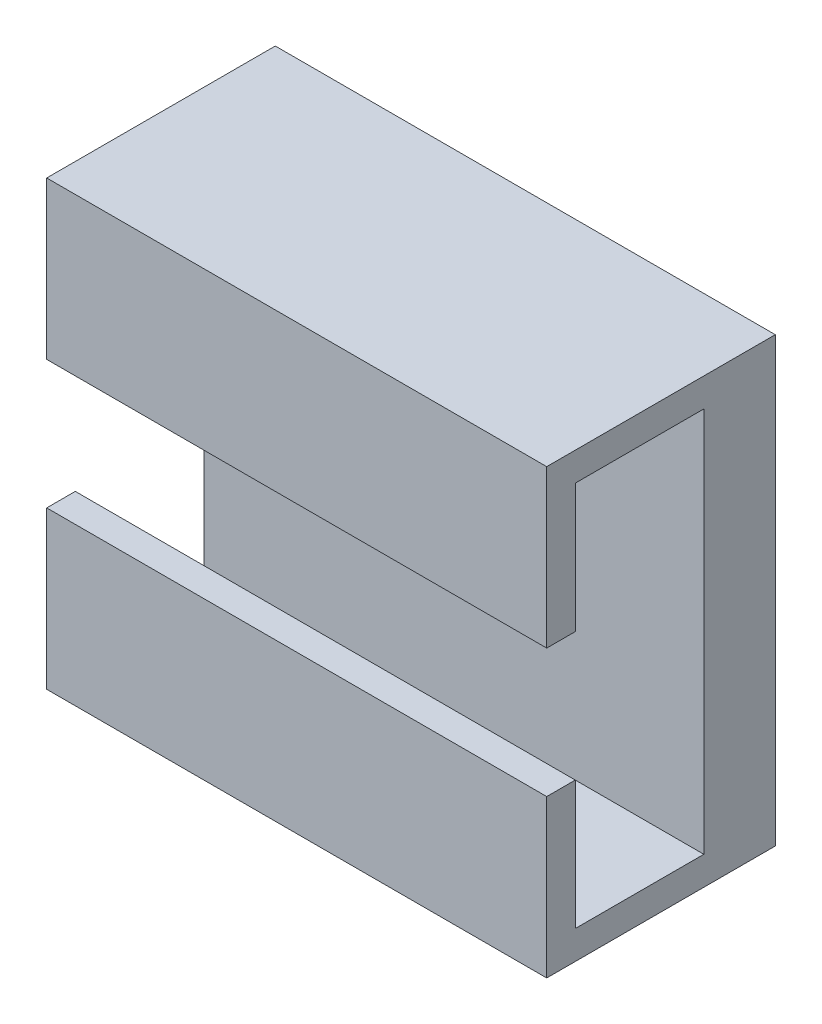
ISO-10303-21;
HEADER;
FILE_DESCRIPTION(('STEP AP214'),'2;1');
FILE_NAME('part.step','',(''),(''),'','','');
FILE_SCHEMA(('AUTOMOTIVE_DESIGN { 1 0 10303 214 1 1 1 1 }'));
ENDSEC;
DATA;
#1=APPLICATION_CONTEXT('core data for automotive mechanical design processes');
#2=APPLICATION_PROTOCOL_DEFINITION('international standard','automotive_design',2000,#1);
#3=PRODUCT_CONTEXT('',#1,'mechanical');
#4=PRODUCT('Part','Part','',(#3));
#5=PRODUCT_RELATED_PRODUCT_CATEGORY('part','',(#4));
#6=PRODUCT_DEFINITION_FORMATION('','',#4);
#7=PRODUCT_DEFINITION_CONTEXT('part definition',#1,'design');
#8=PRODUCT_DEFINITION('design','',#6,#7);
#9=PRODUCT_DEFINITION_SHAPE('','',#8);
#10=(LENGTH_UNIT() NAMED_UNIT(*) SI_UNIT(.MILLI.,.METRE.));
#11=(NAMED_UNIT(*) PLANE_ANGLE_UNIT() SI_UNIT($,.RADIAN.));
#12=(NAMED_UNIT(*) SI_UNIT($,.STERADIAN.) SOLID_ANGLE_UNIT());
#13=UNCERTAINTY_MEASURE_WITH_UNIT(LENGTH_MEASURE(1.E-05),#10,'distance_accuracy_value','');
#14=(GEOMETRIC_REPRESENTATION_CONTEXT(3) GLOBAL_UNCERTAINTY_ASSIGNED_CONTEXT((#13)) GLOBAL_UNIT_ASSIGNED_CONTEXT((#10,
#11,#12)) REPRESENTATION_CONTEXT('',''));
#15=CARTESIAN_POINT('',(0.,0.,0.));
#16=DIRECTION('',(0.,0.,1.));
#17=DIRECTION('',(1.,0.,0.));
#18=AXIS2_PLACEMENT_3D('',#15,#16,#17);
#19=CARTESIAN_POINT('',(0.,0.,0.));
#20=DIRECTION('',(0.,0.,1.));
#21=DIRECTION('',(1.,0.,0.));
#22=AXIS2_PLACEMENT_3D('',#19,#20,#21);
#23=CYLINDRICAL_SURFACE('',#22,1.75);
#24=CARTESIAN_POINT('',(0.,0.,0.));
#25=DIRECTION('',(0.,0.,1.));
#26=DIRECTION('',(1.,0.,0.));
#27=AXIS2_PLACEMENT_3D('',#24,#25,#26);
#28=CIRCLE('',#27,1.75);
#29=CARTESIAN_POINT('',(1.75,0.,0.));
#30=VERTEX_POINT('',#29);
#31=EDGE_CURVE('E176',#30,#30,#28,.T.);
#32=CARTESIAN_POINT('',(0.,0.,2.00000000000001));
#33=DIRECTION('',(0.,0.,1.));
#34=DIRECTION('',(1.,0.,0.));
#35=AXIS2_PLACEMENT_3D('',#32,#33,#34);
#36=CIRCLE('',#35,1.75);
#37=CARTESIAN_POINT('',(1.75,0.,2.00000000000001));
#38=VERTEX_POINT('',#37);
#39=EDGE_CURVE('E43',#38,#38,#36,.F.);
#40=CARTESIAN_POINT('',(1.75,0.,0.));
#41=CARTESIAN_POINT('',(1.75,0.,0.0208333333333335));
#42=CARTESIAN_POINT('',(1.75,0.,0.0416666666666669));
#43=CARTESIAN_POINT('',(1.75,0.,0.0833333333333337));
#44=CARTESIAN_POINT('',(1.75,0.,0.104166666666667));
#45=CARTESIAN_POINT('',(1.75,0.,0.145833333333334));
#46=CARTESIAN_POINT('',(1.75,0.,0.166666666666667));
#47=CARTESIAN_POINT('',(1.75,0.,0.208333333333334));
#48=CARTESIAN_POINT('',(1.75,0.,0.229166666666668));
#49=CARTESIAN_POINT('',(1.75,0.,0.270833333333334));
#50=CARTESIAN_POINT('',(1.75,0.,0.291666666666668));
#51=CARTESIAN_POINT('',(1.75,0.,0.333333333333335));
#52=CARTESIAN_POINT('',(1.75,0.,0.354166666666668));
#53=CARTESIAN_POINT('',(1.75,0.,0.395833333333335));
#54=CARTESIAN_POINT('',(1.75,0.,0.416666666666668));
#55=CARTESIAN_POINT('',(1.75,0.,0.458333333333335));
#56=CARTESIAN_POINT('',(1.75,0.,0.479166666666669));
#57=CARTESIAN_POINT('',(1.75,0.,0.520833333333335));
#58=CARTESIAN_POINT('',(1.75,0.,0.541666666666669));
#59=CARTESIAN_POINT('',(1.75,0.,0.583333333333336));
#60=CARTESIAN_POINT('',(1.75,0.,0.604166666666669));
#61=CARTESIAN_POINT('',(1.75,0.,0.645833333333336));
#62=CARTESIAN_POINT('',(1.75,0.,0.66666666666667));
#63=CARTESIAN_POINT('',(1.75,0.,0.708333333333336));
#64=CARTESIAN_POINT('',(1.75,0.,0.72916666666667));
#65=CARTESIAN_POINT('',(1.75,0.,0.770833333333337));
#66=CARTESIAN_POINT('',(1.75,0.,0.79166666666667));
#67=CARTESIAN_POINT('',(1.75,0.,0.833333333333337));
#68=CARTESIAN_POINT('',(1.75,0.,0.85416666666667));
#69=CARTESIAN_POINT('',(1.75,0.,0.895833333333337));
#70=CARTESIAN_POINT('',(1.75,0.,0.916666666666671));
#71=CARTESIAN_POINT('',(1.75,0.,0.958333333333337));
#72=CARTESIAN_POINT('',(1.75,0.,0.979166666666671));
#73=CARTESIAN_POINT('',(1.75,0.,1.02083333333334));
#74=CARTESIAN_POINT('',(1.75,0.,1.04166666666667));
#75=CARTESIAN_POINT('',(1.75,0.,1.08333333333334));
#76=CARTESIAN_POINT('',(1.75,0.,1.10416666666667));
#77=CARTESIAN_POINT('',(1.75,0.,1.14583333333334));
#78=CARTESIAN_POINT('',(1.75,0.,1.16666666666667));
#79=CARTESIAN_POINT('',(1.75,0.,1.20833333333334));
#80=CARTESIAN_POINT('',(1.75,0.,1.22916666666667));
#81=CARTESIAN_POINT('',(1.75,0.,1.27083333333334));
#82=CARTESIAN_POINT('',(1.75,0.,1.29166666666667));
#83=CARTESIAN_POINT('',(1.75,0.,1.33333333333334));
#84=CARTESIAN_POINT('',(1.75,0.,1.35416666666667));
#85=CARTESIAN_POINT('',(1.75,0.,1.39583333333334));
#86=CARTESIAN_POINT('',(1.75,0.,1.41666666666667));
#87=CARTESIAN_POINT('',(1.75,0.,1.45833333333334));
#88=CARTESIAN_POINT('',(1.75,0.,1.47916666666667));
#89=CARTESIAN_POINT('',(1.75,0.,1.52083333333334));
#90=CARTESIAN_POINT('',(1.75,0.,1.54166666666667));
#91=CARTESIAN_POINT('',(1.75,0.,1.58333333333334));
#92=CARTESIAN_POINT('',(1.75,0.,1.60416666666667));
#93=CARTESIAN_POINT('',(1.75,0.,1.64583333333334));
#94=CARTESIAN_POINT('',(1.75,0.,1.66666666666667));
#95=CARTESIAN_POINT('',(1.75,0.,1.70833333333334));
#96=CARTESIAN_POINT('',(1.75,0.,1.72916666666667));
#97=CARTESIAN_POINT('',(1.75,0.,1.77083333333334));
#98=CARTESIAN_POINT('',(1.75,0.,1.79166666666667));
#99=CARTESIAN_POINT('',(1.75,0.,1.83333333333334));
#100=CARTESIAN_POINT('',(1.75,0.,1.85416666666667));
#101=CARTESIAN_POINT('',(1.75,0.,1.89583333333334));
#102=CARTESIAN_POINT('',(1.75,0.,1.91666666666667));
#103=CARTESIAN_POINT('',(1.75,0.,1.95833333333334));
#104=CARTESIAN_POINT('',(1.75,0.,1.97916666666668));
#105=CARTESIAN_POINT('',(1.75,0.,2.00000000000001));
#106=B_SPLINE_CURVE_WITH_KNOTS('',3,(#40,#41,#42,#43,#44,#45,#46,#47,#48,#49,#50,#51,#52,#53,
#54,#55,#56,#57,#58,#59,#60,#61,#62,#63,#64,#65,#66,#67,#68,#69,#70,#71,#72,#73,#74,#75,#76,#77,
#78,#79,#80,#81,#82,#83,#84,#85,#86,#87,#88,#89,#90,#91,#92,#93,#94,#95,#96,#97,#98,#99,#100,
#101,#102,#103,#104,#105),.UNSPECIFIED.,.F.,.F.,(4,2,2,2,2,2,2,2,2,2,2,2,2,2,2,2,2,2,2,2,2,2,2,
2,2,2,2,2,2,2,2,2,4),(0.,0.0625000000000003,0.125000000000001,0.187500000000001,
0.250000000000001,0.312500000000001,0.375000000000002,0.437500000000002,0.500000000000002,
0.562500000000002,0.625000000000003,0.687500000000003,0.750000000000003,0.812500000000003,
0.875000000000004,0.937500000000004,1.,1.0625,1.125,1.1875,1.25000000000001,1.31250000000001,
1.37500000000001,1.43750000000001,1.50000000000001,1.56250000000001,1.62500000000001,
1.68750000000001,1.75000000000001,1.81250000000001,1.87500000000001,1.93750000000001,
2.00000000000001),.UNSPECIFIED.);
#107=EDGE_CURVE('BSEAM39',#30,#38,#106,.T.);
#108=ORIENTED_EDGE('',*,*,#31,.F.);
#109=ORIENTED_EDGE('',*,*,#39,.F.);
#110=ORIENTED_EDGE('',*,*,#107,.T.);
#111=ORIENTED_EDGE('',*,*,#107,.F.);
#112=EDGE_LOOP('',(#108,#110,#109,#111));
#113=FACE_BOUND('',#112,.T.);
#114=ADVANCED_FACE('F39',(#113),#23,.F.);
#115=CARTESIAN_POINT('',(0.,0.,16.));
#116=DIRECTION('',(0.,0.,-1.));
#117=DIRECTION('',(-1.,0.,0.));
#118=AXIS2_PLACEMENT_3D('',#115,#116,#117);
#119=PLANE('',#118);
#120=DIRECTION('',(0.,-1.,0.));
#121=VECTOR('',#120,1.);
#122=CARTESIAN_POINT('',(-17.5,-15.5,16.));
#123=LINE('',#122,#121);
#124=CARTESIAN_POINT('',(-17.5,15.5,16.));
#125=VERTEX_POINT('',#124);
#126=CARTESIAN_POINT('',(-17.5,4.5,16.));
#127=VERTEX_POINT('',#126);
#128=EDGE_CURVE('E233',#125,#127,#123,.T.);
#129=ORIENTED_EDGE('',*,*,#128,.T.);
#130=DIRECTION('',(-1.,0.,0.));
#131=VECTOR('',#130,1.);
#132=CARTESIAN_POINT('',(17.5,4.5,16.));
#133=LINE('',#132,#131);
#134=CARTESIAN_POINT('',(17.5,4.5,16.));
#135=VERTEX_POINT('',#134);
#136=EDGE_CURVE('E219',#135,#127,#133,.T.);
#137=ORIENTED_EDGE('',*,*,#136,.F.);
#138=DIRECTION('',(0.,1.,0.));
#139=VECTOR('',#138,1.);
#140=CARTESIAN_POINT('',(17.5,-15.5,16.));
#141=LINE('',#140,#139);
#142=CARTESIAN_POINT('',(17.5,15.5,16.));
#143=VERTEX_POINT('',#142);
#144=EDGE_CURVE('E239',#135,#143,#141,.T.);
#145=ORIENTED_EDGE('',*,*,#144,.T.);
#146=DIRECTION('',(-1.,0.,0.));
#147=VECTOR('',#146,1.);
#148=CARTESIAN_POINT('',(-17.5,15.5,16.));
#149=LINE('',#148,#147);
#150=EDGE_CURVE('E65',#143,#125,#149,.T.);
#151=ORIENTED_EDGE('',*,*,#150,.T.);
#152=EDGE_LOOP('',(#129,#137,#145,#151));
#153=FACE_BOUND('',#152,.T.);
#154=ADVANCED_FACE('F282',(#153),#119,.F.);
#155=CARTESIAN_POINT('',(-17.5,-15.5,16.));
#156=DIRECTION('',(1.,0.,0.));
#157=DIRECTION('',(0.,0.,-1.));
#158=AXIS2_PLACEMENT_3D('',#155,#156,#157);
#159=PLANE('',#158);
#160=DIRECTION('',(0.,1.,0.));
#161=VECTOR('',#160,1.);
#162=CARTESIAN_POINT('',(-17.5,4.5,14.));
#163=LINE('',#162,#161);
#164=CARTESIAN_POINT('',(-17.5,4.5,14.));
#165=VERTEX_POINT('',#164);
#166=CARTESIAN_POINT('',(-17.5,13.5,14.));
#167=VERTEX_POINT('',#166);
#168=EDGE_CURVE('E169',#165,#167,#163,.T.);
#169=ORIENTED_EDGE('',*,*,#168,.F.);
#170=DIRECTION('',(0.,0.,-1.));
#171=VECTOR('',#170,1.);
#172=CARTESIAN_POINT('',(-17.5,4.5,16.));
#173=LINE('',#172,#171);
#174=EDGE_CURVE('E173',#127,#165,#173,.T.);
#175=ORIENTED_EDGE('',*,*,#174,.F.);
#176=ORIENTED_EDGE('',*,*,#128,.F.);
#177=DIRECTION('',(0.,0.,-1.));
#178=VECTOR('',#177,1.);
#179=CARTESIAN_POINT('',(-17.5,15.5,16.));
#180=LINE('',#179,#178);
#181=CARTESIAN_POINT('',(-17.5,15.5,0.));
#182=VERTEX_POINT('',#181);
#183=EDGE_CURVE('E246',#125,#182,#180,.T.);
#184=ORIENTED_EDGE('',*,*,#183,.T.);
#185=DIRECTION('',(0.,-1.,0.));
#186=VECTOR('',#185,1.);
#187=CARTESIAN_POINT('',(-17.5,-15.5,0.));
#188=LINE('',#187,#186);
#189=CARTESIAN_POINT('',(-17.5,-15.5,0.));
#190=VERTEX_POINT('',#189);
#191=EDGE_CURVE('E215',#182,#190,#188,.T.);
#192=ORIENTED_EDGE('',*,*,#191,.T.);
#193=DIRECTION('',(0.,0.,-1.));
#194=VECTOR('',#193,1.);
#195=CARTESIAN_POINT('',(-17.5,-15.5,16.));
#196=LINE('',#195,#194);
#197=CARTESIAN_POINT('',(-17.5,-15.5,16.));
#198=VERTEX_POINT('',#197);
#199=EDGE_CURVE('E11',#198,#190,#196,.T.);
#200=ORIENTED_EDGE('',*,*,#199,.F.);
#201=CARTESIAN_POINT('',(-17.5,-4.5,16.));
#202=VERTEX_POINT('',#201);
#203=EDGE_CURVE('E93',#202,#198,#123,.T.);
#204=ORIENTED_EDGE('',*,*,#203,.F.);
#205=DIRECTION('',(0.,0.,1.));
#206=VECTOR('',#205,1.);
#207=CARTESIAN_POINT('',(-17.5,-4.5,14.));
#208=LINE('',#207,#206);
#209=CARTESIAN_POINT('',(-17.5,-4.5,14.));
#210=VERTEX_POINT('',#209);
#211=EDGE_CURVE('E56',#210,#202,#208,.T.);
#212=ORIENTED_EDGE('',*,*,#211,.F.);
#213=DIRECTION('',(0.,1.,0.));
#214=VECTOR('',#213,1.);
#215=CARTESIAN_POINT('',(-17.5,-13.5,14.));
#216=LINE('',#215,#214);
#217=CARTESIAN_POINT('',(-17.5,-13.5,14.));
#218=VERTEX_POINT('',#217);
#219=EDGE_CURVE('E203',#218,#210,#216,.T.);
#220=ORIENTED_EDGE('',*,*,#219,.F.);
#221=DIRECTION('',(0.,0.,1.));
#222=VECTOR('',#221,1.);
#223=CARTESIAN_POINT('',(-17.5,-13.5,5.));
#224=LINE('',#223,#222);
#225=CARTESIAN_POINT('',(-17.5,-13.5,5.));
#226=VERTEX_POINT('',#225);
#227=EDGE_CURVE('E199',#226,#218,#224,.T.);
#228=ORIENTED_EDGE('',*,*,#227,.F.);
#229=DIRECTION('',(0.,-1.,0.));
#230=VECTOR('',#229,1.);
#231=CARTESIAN_POINT('',(-17.5,13.5,5.));
#232=LINE('',#231,#230);
#233=CARTESIAN_POINT('',(-17.5,13.5,5.));
#234=VERTEX_POINT('',#233);
#235=EDGE_CURVE('E196',#234,#226,#232,.T.);
#236=ORIENTED_EDGE('',*,*,#235,.F.);
#237=DIRECTION('',(0.,0.,-1.));
#238=VECTOR('',#237,1.);
#239=CARTESIAN_POINT('',(-17.5,13.5,14.));
#240=LINE('',#239,#238);
#241=EDGE_CURVE('E147',#167,#234,#240,.T.);
#242=ORIENTED_EDGE('',*,*,#241,.F.);
#243=EDGE_LOOP('',(#169,#175,#176,#184,#192,#200,#204,#212,#220,#228,#236,#242));
#244=FACE_BOUND('',#243,.T.);
#245=ADVANCED_FACE('F41',(#244),#159,.F.);
#246=CARTESIAN_POINT('',(-17.5,-15.5,16.));
#247=DIRECTION('',(0.,1.,0.));
#248=DIRECTION('',(0.,0.,1.));
#249=AXIS2_PLACEMENT_3D('',#246,#247,#248);
#250=PLANE('',#249);
#251=DIRECTION('',(1.,0.,0.));
#252=VECTOR('',#251,1.);
#253=CARTESIAN_POINT('',(-17.5,-15.5,0.));
#254=LINE('',#253,#252);
#255=CARTESIAN_POINT('',(17.5,-15.5,0.));
#256=VERTEX_POINT('',#255);
#257=EDGE_CURVE('E250',#190,#256,#254,.T.);
#258=ORIENTED_EDGE('',*,*,#257,.T.);
#259=DIRECTION('',(0.,0.,-1.));
#260=VECTOR('',#259,1.);
#261=CARTESIAN_POINT('',(17.5,-15.5,16.));
#262=LINE('',#261,#260);
#263=CARTESIAN_POINT('',(17.5,-15.5,16.));
#264=VERTEX_POINT('',#263);
#265=EDGE_CURVE('E49',#264,#256,#262,.T.);
#266=ORIENTED_EDGE('',*,*,#265,.F.);
#267=DIRECTION('',(1.,0.,0.));
#268=VECTOR('',#267,1.);
#269=CARTESIAN_POINT('',(-17.5,-15.5,16.));
#270=LINE('',#269,#268);
#271=EDGE_CURVE('E236',#198,#264,#270,.T.);
#272=ORIENTED_EDGE('',*,*,#271,.F.);
#273=ORIENTED_EDGE('',*,*,#199,.T.);
#274=EDGE_LOOP('',(#258,#266,#272,#273));
#275=FACE_BOUND('',#274,.T.);
#276=ADVANCED_FACE('F346',(#275),#250,.F.);
#277=CARTESIAN_POINT('',(17.5,-15.5,16.));
#278=DIRECTION('',(-1.,0.,0.));
#279=DIRECTION('',(0.,0.,1.));
#280=AXIS2_PLACEMENT_3D('',#277,#278,#279);
#281=PLANE('',#280);
#282=ORIENTED_EDGE('',*,*,#144,.F.);
#283=DIRECTION('',(0.,0.,-1.));
#284=VECTOR('',#283,1.);
#285=CARTESIAN_POINT('',(17.5,4.5,16.));
#286=LINE('',#285,#284);
#287=CARTESIAN_POINT('',(17.5,4.5,14.));
#288=VERTEX_POINT('',#287);
#289=EDGE_CURVE('E189',#135,#288,#286,.T.);
#290=ORIENTED_EDGE('',*,*,#289,.T.);
#291=DIRECTION('',(0.,1.,0.));
#292=VECTOR('',#291,1.);
#293=CARTESIAN_POINT('',(17.5,4.5,14.));
#294=LINE('',#293,#292);
#295=CARTESIAN_POINT('',(17.5,13.5,14.));
#296=VERTEX_POINT('',#295);
#297=EDGE_CURVE('E153',#288,#296,#294,.T.);
#298=ORIENTED_EDGE('',*,*,#297,.T.);
#299=DIRECTION('',(0.,0.,-1.));
#300=VECTOR('',#299,1.);
#301=CARTESIAN_POINT('',(17.5,13.5,14.));
#302=LINE('',#301,#300);
#303=CARTESIAN_POINT('',(17.5,13.5,5.));
#304=VERTEX_POINT('',#303);
#305=EDGE_CURVE('E144',#296,#304,#302,.T.);
#306=ORIENTED_EDGE('',*,*,#305,.T.);
#307=DIRECTION('',(0.,-1.,0.));
#308=VECTOR('',#307,1.);
#309=CARTESIAN_POINT('',(17.5,13.5,5.));
#310=LINE('',#309,#308);
#311=CARTESIAN_POINT('',(17.5,-13.5,5.));
#312=VERTEX_POINT('',#311);
#313=EDGE_CURVE('E156',#304,#312,#310,.T.);
#314=ORIENTED_EDGE('',*,*,#313,.T.);
#315=DIRECTION('',(0.,0.,1.));
#316=VECTOR('',#315,1.);
#317=CARTESIAN_POINT('',(17.5,-13.5,5.));
#318=LINE('',#317,#316);
#319=CARTESIAN_POINT('',(17.5,-13.5,14.));
#320=VERTEX_POINT('',#319);
#321=EDGE_CURVE('E162',#312,#320,#318,.T.);
#322=ORIENTED_EDGE('',*,*,#321,.T.);
#323=DIRECTION('',(0.,1.,0.));
#324=VECTOR('',#323,1.);
#325=CARTESIAN_POINT('',(17.5,-13.5,14.));
#326=LINE('',#325,#324);
#327=CARTESIAN_POINT('',(17.5,-4.5,14.));
#328=VERTEX_POINT('',#327);
#329=EDGE_CURVE('E181',#320,#328,#326,.T.);
#330=ORIENTED_EDGE('',*,*,#329,.T.);
#331=DIRECTION('',(0.,0.,1.));
#332=VECTOR('',#331,1.);
#333=CARTESIAN_POINT('',(17.5,-4.5,14.));
#334=LINE('',#333,#332);
#335=CARTESIAN_POINT('',(17.5,-4.5,16.));
#336=VERTEX_POINT('',#335);
#337=EDGE_CURVE('E185',#328,#336,#334,.T.);
#338=ORIENTED_EDGE('',*,*,#337,.T.);
#339=EDGE_CURVE('E240',#264,#336,#141,.T.);
#340=ORIENTED_EDGE('',*,*,#339,.F.);
#341=ORIENTED_EDGE('',*,*,#265,.T.);
#342=DIRECTION('',(0.,1.,0.));
#343=VECTOR('',#342,1.);
#344=CARTESIAN_POINT('',(17.5,-15.5,0.));
#345=LINE('',#344,#343);
#346=CARTESIAN_POINT('',(17.5,15.5,0.));
#347=VERTEX_POINT('',#346);
#348=EDGE_CURVE('E253',#256,#347,#345,.T.);
#349=ORIENTED_EDGE('',*,*,#348,.T.);
#350=DIRECTION('',(0.,0.,-1.));
#351=VECTOR('',#350,1.);
#352=CARTESIAN_POINT('',(17.5,15.5,16.));
#353=LINE('',#352,#351);
#354=EDGE_CURVE('E260',#143,#347,#353,.T.);
#355=ORIENTED_EDGE('',*,*,#354,.F.);
#356=EDGE_LOOP('',(#282,#290,#298,#306,#314,#322,#330,#338,#340,#341,#349,#355));
#357=FACE_BOUND('',#356,.T.);
#358=ADVANCED_FACE('F165',(#357),#281,.F.);
#359=CARTESIAN_POINT('',(-17.5,15.5,16.));
#360=DIRECTION('',(0.,-1.,0.));
#361=DIRECTION('',(0.,0.,-1.));
#362=AXIS2_PLACEMENT_3D('',#359,#360,#361);
#363=PLANE('',#362);
#364=DIRECTION('',(-1.,0.,0.));
#365=VECTOR('',#364,1.);
#366=CARTESIAN_POINT('',(-17.5,15.5,0.));
#367=LINE('',#366,#365);
#368=EDGE_CURVE('E86',#347,#182,#367,.T.);
#369=ORIENTED_EDGE('',*,*,#368,.T.);
#370=ORIENTED_EDGE('',*,*,#183,.F.);
#371=ORIENTED_EDGE('',*,*,#150,.F.);
#372=ORIENTED_EDGE('',*,*,#354,.T.);
#373=EDGE_LOOP('',(#369,#370,#371,#372));
#374=FACE_BOUND('',#373,.T.);
#375=ADVANCED_FACE('F278',(#374),#363,.F.);
#376=ORIENTED_EDGE('',*,*,#339,.T.);
#377=DIRECTION('',(-1.,0.,0.));
#378=VECTOR('',#377,1.);
#379=CARTESIAN_POINT('',(17.5,-4.5,16.));
#380=LINE('',#379,#378);
#381=EDGE_CURVE('E222',#336,#202,#380,.T.);
#382=ORIENTED_EDGE('',*,*,#381,.T.);
#383=ORIENTED_EDGE('',*,*,#203,.T.);
#384=ORIENTED_EDGE('',*,*,#271,.T.);
#385=EDGE_LOOP('',(#376,#382,#383,#384));
#386=FACE_BOUND('',#385,.T.);
#387=ADVANCED_FACE('F303',(#386),#119,.F.);
#388=CARTESIAN_POINT('',(0.,0.,0.));
#389=DIRECTION('',(0.,0.,-1.));
#390=DIRECTION('',(-1.,0.,0.));
#391=AXIS2_PLACEMENT_3D('',#388,#389,#390);
#392=PLANE('',#391);
#393=ORIENTED_EDGE('',*,*,#31,.T.);
#394=EDGE_LOOP('',(#393));
#395=FACE_BOUND('',#394,.T.);
#396=ORIENTED_EDGE('',*,*,#191,.F.);
#397=ORIENTED_EDGE('',*,*,#368,.F.);
#398=ORIENTED_EDGE('',*,*,#348,.F.);
#399=ORIENTED_EDGE('',*,*,#257,.F.);
#400=EDGE_LOOP('',(#396,#397,#398,#399));
#401=FACE_BOUND('',#400,.T.);
#402=ADVANCED_FACE('F272',(#395,#401),#392,.T.);
#403=CARTESIAN_POINT('',(17.5,13.5,14.));
#404=DIRECTION('',(0.,1.,0.));
#405=DIRECTION('',(0.,0.,1.));
#406=AXIS2_PLACEMENT_3D('',#403,#404,#405);
#407=PLANE('',#406);
#408=ORIENTED_EDGE('',*,*,#241,.T.);
#409=DIRECTION('',(-1.,0.,0.));
#410=VECTOR('',#409,1.);
#411=CARTESIAN_POINT('',(17.5,13.5,5.));
#412=LINE('',#411,#410);
#413=EDGE_CURVE('E140',#304,#234,#412,.T.);
#414=ORIENTED_EDGE('',*,*,#413,.F.);
#415=ORIENTED_EDGE('',*,*,#305,.F.);
#416=DIRECTION('',(-1.,0.,0.));
#417=VECTOR('',#416,1.);
#418=CARTESIAN_POINT('',(17.5,13.5,14.));
#419=LINE('',#418,#417);
#420=EDGE_CURVE('E212',#296,#167,#419,.T.);
#421=ORIENTED_EDGE('',*,*,#420,.T.);
#422=EDGE_LOOP('',(#408,#414,#415,#421));
#423=FACE_BOUND('',#422,.T.);
#424=ADVANCED_FACE('F142',(#423),#407,.F.);
#425=CARTESIAN_POINT('',(17.5,4.5,14.));
#426=DIRECTION('',(0.,0.,1.));
#427=DIRECTION('',(0.,-1.,0.));
#428=AXIS2_PLACEMENT_3D('',#425,#426,#427);
#429=PLANE('',#428);
#430=ORIENTED_EDGE('',*,*,#168,.T.);
#431=ORIENTED_EDGE('',*,*,#420,.F.);
#432=ORIENTED_EDGE('',*,*,#297,.F.);
#433=DIRECTION('',(-1.,0.,0.));
#434=VECTOR('',#433,1.);
#435=CARTESIAN_POINT('',(17.5,4.5,14.));
#436=LINE('',#435,#434);
#437=EDGE_CURVE('E216',#288,#165,#436,.T.);
#438=ORIENTED_EDGE('',*,*,#437,.T.);
#439=EDGE_LOOP('',(#430,#431,#432,#438));
#440=FACE_BOUND('',#439,.T.);
#441=ADVANCED_FACE('F286',(#440),#429,.F.);
#442=CARTESIAN_POINT('',(17.5,4.5,16.));
#443=DIRECTION('',(0.,1.,0.));
#444=DIRECTION('',(0.,0.,1.));
#445=AXIS2_PLACEMENT_3D('',#442,#443,#444);
#446=PLANE('',#445);
#447=ORIENTED_EDGE('',*,*,#174,.T.);
#448=ORIENTED_EDGE('',*,*,#437,.F.);
#449=ORIENTED_EDGE('',*,*,#289,.F.);
#450=ORIENTED_EDGE('',*,*,#136,.T.);
#451=EDGE_LOOP('',(#447,#448,#449,#450));
#452=FACE_BOUND('',#451,.T.);
#453=ADVANCED_FACE('F284',(#452),#446,.F.);
#454=CARTESIAN_POINT('',(17.5,-4.5,14.));
#455=DIRECTION('',(0.,-1.,0.));
#456=DIRECTION('',(0.,0.,-1.));
#457=AXIS2_PLACEMENT_3D('',#454,#455,#456);
#458=PLANE('',#457);
#459=ORIENTED_EDGE('',*,*,#211,.T.);
#460=ORIENTED_EDGE('',*,*,#381,.F.);
#461=ORIENTED_EDGE('',*,*,#337,.F.);
#462=DIRECTION('',(-1.,0.,0.));
#463=VECTOR('',#462,1.);
#464=CARTESIAN_POINT('',(17.5,-4.5,14.));
#465=LINE('',#464,#463);
#466=EDGE_CURVE('E225',#328,#210,#465,.T.);
#467=ORIENTED_EDGE('',*,*,#466,.T.);
#468=EDGE_LOOP('',(#459,#460,#461,#467));
#469=FACE_BOUND('',#468,.T.);
#470=ADVANCED_FACE('F293',(#469),#458,.F.);
#471=CARTESIAN_POINT('',(17.5,-13.5,14.));
#472=DIRECTION('',(0.,0.,1.));
#473=DIRECTION('',(1.,0.,0.));
#474=AXIS2_PLACEMENT_3D('',#471,#472,#473);
#475=PLANE('',#474);
#476=ORIENTED_EDGE('',*,*,#219,.T.);
#477=ORIENTED_EDGE('',*,*,#466,.F.);
#478=ORIENTED_EDGE('',*,*,#329,.F.);
#479=DIRECTION('',(-1.,0.,0.));
#480=VECTOR('',#479,1.);
#481=CARTESIAN_POINT('',(17.5,-13.5,14.));
#482=LINE('',#481,#480);
#483=EDGE_CURVE('E228',#320,#218,#482,.T.);
#484=ORIENTED_EDGE('',*,*,#483,.T.);
#485=EDGE_LOOP('',(#476,#477,#478,#484));
#486=FACE_BOUND('',#485,.T.);
#487=ADVANCED_FACE('F355',(#486),#475,.F.);
#488=CARTESIAN_POINT('',(17.5,-13.5,5.));
#489=DIRECTION('',(0.,-1.,0.));
#490=DIRECTION('',(0.,0.,-1.));
#491=AXIS2_PLACEMENT_3D('',#488,#489,#490);
#492=PLANE('',#491);
#493=ORIENTED_EDGE('',*,*,#227,.T.);
#494=ORIENTED_EDGE('',*,*,#483,.F.);
#495=ORIENTED_EDGE('',*,*,#321,.F.);
#496=DIRECTION('',(-1.,0.,0.));
#497=VECTOR('',#496,1.);
#498=CARTESIAN_POINT('',(17.5,-13.5,5.));
#499=LINE('',#498,#497);
#500=EDGE_CURVE('E152',#312,#226,#499,.T.);
#501=ORIENTED_EDGE('',*,*,#500,.T.);
#502=EDGE_LOOP('',(#493,#494,#495,#501));
#503=FACE_BOUND('',#502,.T.);
#504=ADVANCED_FACE('F317',(#503),#492,.F.);
#505=CARTESIAN_POINT('',(17.5,13.5,5.));
#506=DIRECTION('',(0.,0.,-1.));
#507=DIRECTION('',(0.,1.,0.));
#508=AXIS2_PLACEMENT_3D('',#505,#506,#507);
#509=PLANE('',#508);
#510=CARTESIAN_POINT('',(0.,0.,5.));
#511=DIRECTION('',(0.,0.,1.));
#512=DIRECTION('',(1.,0.,0.));
#513=AXIS2_PLACEMENT_3D('',#510,#511,#512);
#514=CIRCLE('',#513,2.75);
#515=CARTESIAN_POINT('',(2.75,0.,5.));
#516=VERTEX_POINT('',#515);
#517=EDGE_CURVE('E330',#516,#516,#514,.T.);
#518=ORIENTED_EDGE('',*,*,#517,.F.);
#519=EDGE_LOOP('',(#518));
#520=FACE_BOUND('',#519,.T.);
#521=ORIENTED_EDGE('',*,*,#235,.T.);
#522=ORIENTED_EDGE('',*,*,#500,.F.);
#523=ORIENTED_EDGE('',*,*,#313,.F.);
#524=ORIENTED_EDGE('',*,*,#413,.T.);
#525=EDGE_LOOP('',(#521,#522,#523,#524));
#526=FACE_BOUND('',#525,.T.);
#527=ADVANCED_FACE('F157',(#520,#526),#509,.F.);
#528=CARTESIAN_POINT('',(0.,0.,2.00000000000001));
#529=DIRECTION('',(0.,0.,1.));
#530=DIRECTION('',(1.,0.,0.));
#531=AXIS2_PLACEMENT_3D('',#528,#529,#530);
#532=PLANE('',#531);
#533=CARTESIAN_POINT('',(0.,0.,2.00000000000001));
#534=DIRECTION('',(0.,0.,1.));
#535=DIRECTION('',(1.,0.,0.));
#536=AXIS2_PLACEMENT_3D('',#533,#534,#535);
#537=CIRCLE('',#536,2.75);
#538=CARTESIAN_POINT('',(2.75,0.,2.00000000000001));
#539=VERTEX_POINT('',#538);
#540=EDGE_CURVE('E323',#539,#539,#537,.T.);
#541=ORIENTED_EDGE('',*,*,#540,.T.);
#542=EDGE_LOOP('',(#541));
#543=FACE_BOUND('',#542,.T.);
#544=ORIENTED_EDGE('',*,*,#39,.T.);
#545=EDGE_LOOP('',(#544));
#546=FACE_BOUND('',#545,.T.);
#547=ADVANCED_FACE('F310',(#543,#546),#532,.T.);
#548=CARTESIAN_POINT('',(0.,0.,2.00000000000001));
#549=DIRECTION('',(0.,0.,1.));
#550=DIRECTION('',(1.,0.,0.));
#551=AXIS2_PLACEMENT_3D('',#548,#549,#550);
#552=CYLINDRICAL_SURFACE('',#551,2.75);
#553=ORIENTED_EDGE('',*,*,#540,.F.);
#554=EDGE_LOOP('',(#553));
#555=FACE_BOUND('',#554,.T.);
#556=ORIENTED_EDGE('',*,*,#517,.T.);
#557=EDGE_LOOP('',(#556));
#558=FACE_BOUND('',#557,.T.);
#559=ADVANCED_FACE('F307',(#555,#558),#552,.F.);
#560=CLOSED_SHELL('',(#114,#154,#245,#276,#358,#375,#387,#402,#424,#441,#453,#470,#487,#504,
#527,#547,#559));
#561=MANIFOLD_SOLID_BREP('B2',#560);
#562=ADVANCED_BREP_SHAPE_REPRESENTATION('',(#18,#561),#14);
#563=SHAPE_DEFINITION_REPRESENTATION(#9,#562);
ENDSEC;
END-ISO-10303-21;
